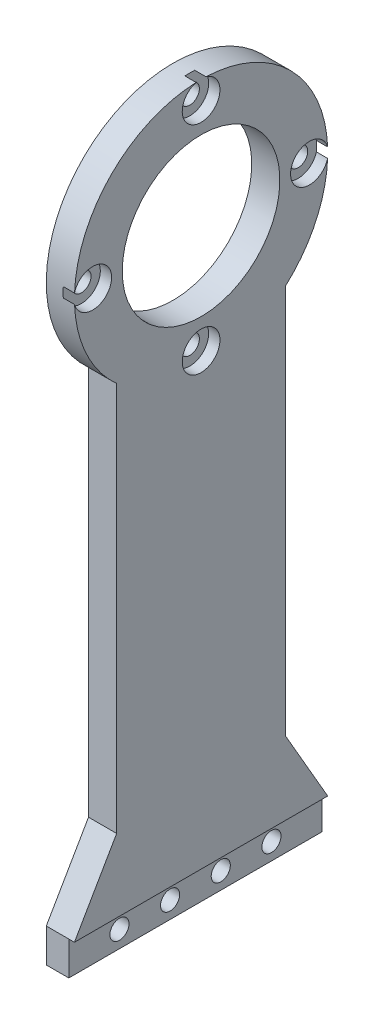
ISO-10303-21;
HEADER;
FILE_DESCRIPTION(('STEP AP214'),'2;1');
FILE_NAME('part.step','',(''),(''),'','','');
FILE_SCHEMA(('AUTOMOTIVE_DESIGN { 1 0 10303 214 1 1 1 1 }'));
ENDSEC;
DATA;
#1=APPLICATION_CONTEXT('core data for automotive mechanical design processes');
#2=APPLICATION_PROTOCOL_DEFINITION('international standard','automotive_design',2000,#1);
#3=PRODUCT_CONTEXT('',#1,'mechanical');
#4=PRODUCT('Part','Part','',(#3));
#5=PRODUCT_RELATED_PRODUCT_CATEGORY('part','',(#4));
#6=PRODUCT_DEFINITION_FORMATION('','',#4);
#7=PRODUCT_DEFINITION_CONTEXT('part definition',#1,'design');
#8=PRODUCT_DEFINITION('design','',#6,#7);
#9=PRODUCT_DEFINITION_SHAPE('','',#8);
#10=(LENGTH_UNIT() NAMED_UNIT(*) SI_UNIT(.MILLI.,.METRE.));
#11=(NAMED_UNIT(*) PLANE_ANGLE_UNIT() SI_UNIT($,.RADIAN.));
#12=(NAMED_UNIT(*) SI_UNIT($,.STERADIAN.) SOLID_ANGLE_UNIT());
#13=UNCERTAINTY_MEASURE_WITH_UNIT(LENGTH_MEASURE(1.E-05),#10,'distance_accuracy_value','');
#14=(GEOMETRIC_REPRESENTATION_CONTEXT(3) GLOBAL_UNCERTAINTY_ASSIGNED_CONTEXT((#13)) GLOBAL_UNIT_ASSIGNED_CONTEXT((#10,
#11,#12)) REPRESENTATION_CONTEXT('',''));
#15=CARTESIAN_POINT('',(0.,0.,0.));
#16=DIRECTION('',(0.,0.,1.));
#17=DIRECTION('',(1.,0.,0.));
#18=AXIS2_PLACEMENT_3D('',#15,#16,#17);
#19=CARTESIAN_POINT('',(0.,227.,30.));
#20=DIRECTION('',(0.,0.,-1.));
#21=DIRECTION('',(-1.,0.,0.));
#22=AXIS2_PLACEMENT_3D('',#19,#20,#21);
#23=PLANE('',#22);
#24=DIRECTION('',(0.,-1.,0.));
#25=VECTOR('',#24,1.);
#26=CARTESIAN_POINT('',(0.,227.,30.));
#27=LINE('',#26,#25);
#28=CARTESIAN_POINT('',(0.,88.2294901687515,30.));
#29=VERTEX_POINT('',#28);
#30=CARTESIAN_POINT('',(0.,18.9903810567669,30.));
#31=VERTEX_POINT('',#30);
#32=EDGE_CURVE('E60',#29,#31,#27,.T.);
#33=ORIENTED_EDGE('',*,*,#32,.T.);
#34=DIRECTION('',(1.,0.,0.));
#35=VECTOR('',#34,1.);
#36=CARTESIAN_POINT('',(-48.84295827119,18.9903810567669,30.));
#37=LINE('',#36,#35);
#38=CARTESIAN_POINT('',(5.,18.9903810567669,30.));
#39=VERTEX_POINT('',#38);
#40=EDGE_CURVE('E306',#31,#39,#37,.T.);
#41=ORIENTED_EDGE('',*,*,#40,.T.);
#42=DIRECTION('',(0.,-1.,0.));
#43=VECTOR('',#42,1.);
#44=CARTESIAN_POINT('',(5.,227.,30.));
#45=LINE('',#44,#43);
#46=CARTESIAN_POINT('',(5.,88.2294901687515,30.));
#47=VERTEX_POINT('',#46);
#48=EDGE_CURVE('E233',#47,#39,#45,.T.);
#49=ORIENTED_EDGE('',*,*,#48,.F.);
#50=DIRECTION('',(-1.,0.,0.));
#51=VECTOR('',#50,1.);
#52=CARTESIAN_POINT('',(68.6396103067893,88.2294901687515,30.));
#53=LINE('',#52,#51);
#54=EDGE_CURVE('E223',#47,#29,#53,.T.);
#55=ORIENTED_EDGE('',*,*,#54,.T.);
#56=EDGE_LOOP('',(#33,#41,#49,#55));
#57=FACE_BOUND('',#56,.T.);
#58=ADVANCED_FACE('F37',(#57),#23,.F.);
#59=CARTESIAN_POINT('',(0.,227.,0.));
#60=DIRECTION('',(1.,0.,0.));
#61=DIRECTION('',(0.,0.,-1.));
#62=AXIS2_PLACEMENT_3D('',#59,#60,#61);
#63=PLANE('',#62);
#64=CARTESIAN_POINT('',(0.,3.00000000000006,28.5));
#65=DIRECTION('',(1.,0.,0.));
#66=DIRECTION('',(0.,0.,-1.));
#67=AXIS2_PLACEMENT_3D('',#64,#65,#66);
#68=CIRCLE('',#67,1.7);
#69=CARTESIAN_POINT('',(0.,3.00000000000006,26.8));
#70=VERTEX_POINT('',#69);
#71=EDGE_CURVE('E281',#70,#70,#68,.T.);
#72=ORIENTED_EDGE('',*,*,#71,.T.);
#73=EDGE_LOOP('',(#72));
#74=FACE_BOUND('',#73,.T.);
#75=CARTESIAN_POINT('',(0.,3.00000000000006,19.5));
#76=DIRECTION('',(1.,0.,0.));
#77=DIRECTION('',(0.,0.,-1.));
#78=AXIS2_PLACEMENT_3D('',#75,#76,#77);
#79=CIRCLE('',#78,1.7);
#80=CARTESIAN_POINT('',(0.,3.00000000000006,17.8));
#81=VERTEX_POINT('',#80);
#82=EDGE_CURVE('E284',#81,#81,#79,.T.);
#83=ORIENTED_EDGE('',*,*,#82,.T.);
#84=EDGE_LOOP('',(#83));
#85=FACE_BOUND('',#84,.T.);
#86=CARTESIAN_POINT('',(0.,3.00000000000006,10.5));
#87=DIRECTION('',(1.,0.,0.));
#88=DIRECTION('',(0.,0.,-1.));
#89=AXIS2_PLACEMENT_3D('',#86,#87,#88);
#90=CIRCLE('',#89,1.7);
#91=CARTESIAN_POINT('',(0.,3.00000000000006,8.79999999999999));
#92=VERTEX_POINT('',#91);
#93=EDGE_CURVE('E287',#92,#92,#90,.T.);
#94=ORIENTED_EDGE('',*,*,#93,.T.);
#95=EDGE_LOOP('',(#94));
#96=FACE_BOUND('',#95,.T.);
#97=CARTESIAN_POINT('',(0.,3.00000000000006,1.49999999999999));
#98=DIRECTION('',(1.,0.,0.));
#99=DIRECTION('',(0.,0.,-1.));
#100=AXIS2_PLACEMENT_3D('',#97,#98,#99);
#101=CIRCLE('',#100,1.7);
#102=CARTESIAN_POINT('',(0.,3.00000000000006,-0.200000000000008));
#103=VERTEX_POINT('',#102);
#104=EDGE_CURVE('E290',#103,#103,#101,.T.);
#105=ORIENTED_EDGE('',*,*,#104,.T.);
#106=EDGE_LOOP('',(#105));
#107=FACE_BOUND('',#106,.T.);
#108=CARTESIAN_POINT('',(0.,124.25,15.));
#109=DIRECTION('',(1.,0.,0.));
#110=DIRECTION('',(0.,0.,-1.));
#111=AXIS2_PLACEMENT_3D('',#108,#109,#110);
#112=CIRCLE('',#111,1.69999999999999);
#113=CARTESIAN_POINT('',(0.,124.25,13.3));
#114=VERTEX_POINT('',#113);
#115=EDGE_CURVE('E179',#114,#114,#112,.T.);
#116=ORIENTED_EDGE('',*,*,#115,.T.);
#117=EDGE_LOOP('',(#116));
#118=FACE_BOUND('',#117,.T.);
#119=CARTESIAN_POINT('',(0.,105.,-4.24999999999999));
#120=DIRECTION('',(1.,0.,0.));
#121=DIRECTION('',(0.,0.,-1.));
#122=AXIS2_PLACEMENT_3D('',#119,#120,#121);
#123=CIRCLE('',#122,1.69999999999999);
#124=CARTESIAN_POINT('',(0.,105.,-5.94999999999998));
#125=VERTEX_POINT('',#124);
#126=EDGE_CURVE('E189',#125,#125,#123,.T.);
#127=ORIENTED_EDGE('',*,*,#126,.T.);
#128=EDGE_LOOP('',(#127));
#129=FACE_BOUND('',#128,.T.);
#130=CARTESIAN_POINT('',(0.,85.75,15.));
#131=DIRECTION('',(1.,0.,0.));
#132=DIRECTION('',(0.,0.,-1.));
#133=AXIS2_PLACEMENT_3D('',#130,#131,#132);
#134=CIRCLE('',#133,1.69999999999999);
#135=CARTESIAN_POINT('',(0.,85.75,13.3));
#136=VERTEX_POINT('',#135);
#137=EDGE_CURVE('E201',#136,#136,#134,.T.);
#138=ORIENTED_EDGE('',*,*,#137,.T.);
#139=EDGE_LOOP('',(#138));
#140=FACE_BOUND('',#139,.T.);
#141=CARTESIAN_POINT('',(0.,105.,34.2499999999999));
#142=DIRECTION('',(1.,0.,0.));
#143=DIRECTION('',(0.,0.,-1.));
#144=AXIS2_PLACEMENT_3D('',#141,#142,#143);
#145=CIRCLE('',#144,1.69999999999999);
#146=CARTESIAN_POINT('',(0.,105.,32.5499999999999));
#147=VERTEX_POINT('',#146);
#148=EDGE_CURVE('E212',#147,#147,#145,.T.);
#149=ORIENTED_EDGE('',*,*,#148,.T.);
#150=EDGE_LOOP('',(#149));
#151=FACE_BOUND('',#150,.T.);
#152=CARTESIAN_POINT('',(0.,105.,15.));
#153=DIRECTION('',(-1.,0.,0.));
#154=DIRECTION('',(0.,0.,1.));
#155=AXIS2_PLACEMENT_3D('',#152,#153,#154);
#156=CIRCLE('',#155,14.);
#157=CARTESIAN_POINT('',(0.,105.,29.));
#158=VERTEX_POINT('',#157);
#159=EDGE_CURVE('E215',#158,#158,#156,.T.);
#160=ORIENTED_EDGE('',*,*,#159,.F.);
#161=EDGE_LOOP('',(#160));
#162=FACE_BOUND('',#161,.T.);
#163=CARTESIAN_POINT('',(0.,105.,15.));
#164=DIRECTION('',(-1.,0.,0.));
#165=DIRECTION('',(0.,0.,1.));
#166=AXIS2_PLACEMENT_3D('',#163,#164,#165);
#167=CIRCLE('',#166,22.5);
#168=CARTESIAN_POINT('',(0.,88.2294901687516,0.));
#169=VERTEX_POINT('',#168);
#170=EDGE_CURVE('E219',#29,#169,#167,.T.);
#171=ORIENTED_EDGE('',*,*,#170,.T.);
#172=DIRECTION('',(0.,-1.,0.));
#173=VECTOR('',#172,1.);
#174=CARTESIAN_POINT('',(0.,227.,0.));
#175=LINE('',#174,#173);
#176=CARTESIAN_POINT('',(0.,18.9903810567668,0.));
#177=VERTEX_POINT('',#176);
#178=EDGE_CURVE('E227',#169,#177,#175,.T.);
#179=ORIENTED_EDGE('',*,*,#178,.T.);
#180=DIRECTION('',(0.,-0.866025403784442,-0.499999999999995));
#181=VECTOR('',#180,1.);
#182=CARTESIAN_POINT('',(0.,18.9903810567668,0.));
#183=LINE('',#182,#181);
#184=CARTESIAN_POINT('',(0.,6.,-7.50000000000001));
#185=VERTEX_POINT('',#184);
#186=EDGE_CURVE('E297',#177,#185,#183,.T.);
#187=ORIENTED_EDGE('',*,*,#186,.T.);
#188=DIRECTION('',(0.,-1.,0.));
#189=VECTOR('',#188,1.);
#190=CARTESIAN_POINT('',(0.,6.,-7.50000000000001));
#191=LINE('',#190,#189);
#192=CARTESIAN_POINT('',(0.,0.,-7.50000000000001));
#193=VERTEX_POINT('',#192);
#194=EDGE_CURVE('E294',#185,#193,#191,.T.);
#195=ORIENTED_EDGE('',*,*,#194,.T.);
#196=DIRECTION('',(0.,0.,1.));
#197=VECTOR('',#196,1.);
#198=CARTESIAN_POINT('',(0.,0.,0.));
#199=LINE('',#198,#197);
#200=CARTESIAN_POINT('',(0.,0.,37.5));
#201=VERTEX_POINT('',#200);
#202=EDGE_CURVE('E225',#193,#201,#199,.T.);
#203=ORIENTED_EDGE('',*,*,#202,.T.);
#204=DIRECTION('',(0.,1.,0.));
#205=VECTOR('',#204,1.);
#206=CARTESIAN_POINT('',(0.,6.,37.5));
#207=LINE('',#206,#205);
#208=CARTESIAN_POINT('',(0.,6.,37.5));
#209=VERTEX_POINT('',#208);
#210=EDGE_CURVE('E167',#201,#209,#207,.T.);
#211=ORIENTED_EDGE('',*,*,#210,.T.);
#212=DIRECTION('',(0.,0.866025403784444,-0.499999999999992));
#213=VECTOR('',#212,1.);
#214=CARTESIAN_POINT('',(0.,6.,37.5));
#215=LINE('',#214,#213);
#216=EDGE_CURVE('E171',#209,#31,#215,.T.);
#217=ORIENTED_EDGE('',*,*,#216,.T.);
#218=ORIENTED_EDGE('',*,*,#32,.F.);
#219=EDGE_LOOP('',(#171,#179,#187,#195,#203,#211,#217,#218));
#220=FACE_BOUND('',#219,.T.);
#221=ADVANCED_FACE('F39',(#74,#85,#96,#107,#118,#129,#140,#151,#162,#220),#63,.F.);
#222=CARTESIAN_POINT('',(5.,227.,0.));
#223=DIRECTION('',(-1.,0.,0.));
#224=DIRECTION('',(0.,0.,1.));
#225=AXIS2_PLACEMENT_3D('',#222,#223,#224);
#226=PLANE('',#225);
#227=CARTESIAN_POINT('',(5.,105.,15.));
#228=DIRECTION('',(-1.,0.,0.));
#229=DIRECTION('',(0.,0.,1.));
#230=AXIS2_PLACEMENT_3D('',#227,#228,#229);
#231=CIRCLE('',#230,22.5);
#232=CARTESIAN_POINT('',(5.,105.878142752562,-7.48285714285714));
#233=VERTEX_POINT('',#232);
#234=CARTESIAN_POINT('',(5.,127.482857142857,14.1218572474377));
#235=VERTEX_POINT('',#234);
#236=EDGE_CURVE('E147',#233,#235,#231,.F.);
#237=ORIENTED_EDGE('',*,*,#236,.T.);
#238=CARTESIAN_POINT('',(5.,124.25,15.));
#239=DIRECTION('',(1.,0.,0.));
#240=DIRECTION('',(0.,0.,-1.));
#241=AXIS2_PLACEMENT_3D('',#238,#239,#240);
#242=CIRCLE('',#241,3.35000000000001);
#243=CARTESIAN_POINT('',(5.,127.482857142857,15.8781427525622));
#244=VERTEX_POINT('',#243);
#245=EDGE_CURVE('E152',#244,#235,#242,.T.);
#246=ORIENTED_EDGE('',*,*,#245,.F.);
#247=CARTESIAN_POINT('',(5.,105.878142752562,37.4828571428572));
#248=VERTEX_POINT('',#247);
#249=EDGE_CURVE('E52',#244,#248,#231,.F.);
#250=ORIENTED_EDGE('',*,*,#249,.T.);
#251=CARTESIAN_POINT('',(5.,105.,34.2499999999999));
#252=DIRECTION('',(1.,0.,0.));
#253=DIRECTION('',(0.,0.,-1.));
#254=AXIS2_PLACEMENT_3D('',#251,#252,#253);
#255=CIRCLE('',#254,3.34999999999999);
#256=CARTESIAN_POINT('',(5.,104.121857247438,37.4828571428572));
#257=VERTEX_POINT('',#256);
#258=EDGE_CURVE('E204',#257,#248,#255,.T.);
#259=ORIENTED_EDGE('',*,*,#258,.F.);
#260=EDGE_CURVE('E158',#257,#47,#231,.F.);
#261=ORIENTED_EDGE('',*,*,#260,.T.);
#262=ORIENTED_EDGE('',*,*,#48,.T.);
#263=DIRECTION('',(0.,-0.866025403784443,0.499999999999992));
#264=VECTOR('',#263,1.);
#265=CARTESIAN_POINT('',(5.,6.,37.5));
#266=LINE('',#265,#264);
#267=CARTESIAN_POINT('',(5.,6.,37.5));
#268=VERTEX_POINT('',#267);
#269=EDGE_CURVE('E303',#39,#268,#266,.T.);
#270=ORIENTED_EDGE('',*,*,#269,.T.);
#271=DIRECTION('',(0.,0.,1.));
#272=VECTOR('',#271,1.);
#273=CARTESIAN_POINT('',(5.,6.00000000000006,37.5));
#274=LINE('',#273,#272);
#275=CARTESIAN_POINT('',(5.,6.00000000000006,-7.5));
#276=VERTEX_POINT('',#275);
#277=EDGE_CURVE('E273',#276,#268,#274,.T.);
#278=ORIENTED_EDGE('',*,*,#277,.F.);
#279=DIRECTION('',(0.,0.866025403784442,0.499999999999995));
#280=VECTOR('',#279,1.);
#281=CARTESIAN_POINT('',(5.,18.9903810567668,0.));
#282=LINE('',#281,#280);
#283=CARTESIAN_POINT('',(5.,18.9903810567668,0.));
#284=VERTEX_POINT('',#283);
#285=EDGE_CURVE('E293',#276,#284,#282,.T.);
#286=ORIENTED_EDGE('',*,*,#285,.T.);
#287=DIRECTION('',(0.,-1.,0.));
#288=VECTOR('',#287,1.);
#289=CARTESIAN_POINT('',(5.,227.,0.));
#290=LINE('',#289,#288);
#291=CARTESIAN_POINT('',(5.00000000000001,88.2294901687516,0.));
#292=VERTEX_POINT('',#291);
#293=EDGE_CURVE('E230',#292,#284,#290,.T.);
#294=ORIENTED_EDGE('',*,*,#293,.F.);
#295=CARTESIAN_POINT('',(5.,104.121857247438,-7.48285714285714));
#296=VERTEX_POINT('',#295);
#297=EDGE_CURVE('E156',#292,#296,#231,.F.);
#298=ORIENTED_EDGE('',*,*,#297,.T.);
#299=CARTESIAN_POINT('',(5.,105.,-4.24999999999999));
#300=DIRECTION('',(1.,0.,0.));
#301=DIRECTION('',(0.,0.,-1.));
#302=AXIS2_PLACEMENT_3D('',#299,#300,#301);
#303=CIRCLE('',#302,3.34999999999999);
#304=EDGE_CURVE('E154',#233,#296,#303,.T.);
#305=ORIENTED_EDGE('',*,*,#304,.F.);
#306=EDGE_LOOP('',(#237,#246,#250,#259,#261,#262,#270,#278,#286,#294,#298,#305));
#307=FACE_BOUND('',#306,.T.);
#308=CARTESIAN_POINT('',(5.,85.75,15.));
#309=DIRECTION('',(1.,0.,0.));
#310=DIRECTION('',(0.,0.,-1.));
#311=AXIS2_PLACEMENT_3D('',#308,#309,#310);
#312=CIRCLE('',#311,3.34999999999999);
#313=CARTESIAN_POINT('',(5.,85.75,11.65));
#314=VERTEX_POINT('',#313);
#315=EDGE_CURVE('E192',#314,#314,#312,.T.);
#316=ORIENTED_EDGE('',*,*,#315,.F.);
#317=EDGE_LOOP('',(#316));
#318=FACE_BOUND('',#317,.T.);
#319=CARTESIAN_POINT('',(5.00000000000001,105.,15.));
#320=DIRECTION('',(-1.,0.,0.));
#321=DIRECTION('',(0.,0.,1.));
#322=AXIS2_PLACEMENT_3D('',#319,#320,#321);
#323=CIRCLE('',#322,14.);
#324=CARTESIAN_POINT('',(5.00000000000001,105.,29.));
#325=VERTEX_POINT('',#324);
#326=EDGE_CURVE('E216',#325,#325,#323,.T.);
#327=ORIENTED_EDGE('',*,*,#326,.T.);
#328=EDGE_LOOP('',(#327));
#329=FACE_BOUND('',#328,.T.);
#330=ADVANCED_FACE('F149',(#307,#318,#329),#226,.F.);
#331=CARTESIAN_POINT('',(0.,227.,0.));
#332=DIRECTION('',(0.,0.,1.));
#333=DIRECTION('',(1.,0.,0.));
#334=AXIS2_PLACEMENT_3D('',#331,#332,#333);
#335=PLANE('',#334);
#336=ORIENTED_EDGE('',*,*,#293,.T.);
#337=DIRECTION('',(1.,0.,0.));
#338=VECTOR('',#337,1.);
#339=CARTESIAN_POINT('',(-48.84295827119,18.9903810567668,0.));
#340=LINE('',#339,#338);
#341=EDGE_CURVE('E308',#177,#284,#340,.T.);
#342=ORIENTED_EDGE('',*,*,#341,.F.);
#343=ORIENTED_EDGE('',*,*,#178,.F.);
#344=DIRECTION('',(-1.,0.,0.));
#345=VECTOR('',#344,1.);
#346=CARTESIAN_POINT('',(68.6396103067893,88.2294901687516,0.));
#347=LINE('',#346,#345);
#348=EDGE_CURVE('E237',#169,#292,#347,.F.);
#349=ORIENTED_EDGE('',*,*,#348,.T.);
#350=EDGE_LOOP('',(#336,#342,#343,#349));
#351=FACE_BOUND('',#350,.T.);
#352=ADVANCED_FACE('F353',(#351),#335,.F.);
#353=CARTESIAN_POINT('',(0.,0.,0.));
#354=DIRECTION('',(0.,1.,0.));
#355=DIRECTION('',(0.,0.,1.));
#356=AXIS2_PLACEMENT_3D('',#353,#354,#355);
#357=PLANE('',#356);
#358=DIRECTION('',(1.,0.,0.));
#359=VECTOR('',#358,1.);
#360=CARTESIAN_POINT('',(-48.84295827119,0.,-7.50000000000001));
#361=LINE('',#360,#359);
#362=CARTESIAN_POINT('',(4.,0.,-7.5));
#363=VERTEX_POINT('',#362);
#364=EDGE_CURVE('E312',#193,#363,#361,.T.);
#365=ORIENTED_EDGE('',*,*,#364,.T.);
#366=DIRECTION('',(0.,0.,-1.));
#367=VECTOR('',#366,1.);
#368=CARTESIAN_POINT('',(4.,0.,37.5));
#369=LINE('',#368,#367);
#370=CARTESIAN_POINT('',(4.,0.,37.5));
#371=VERTEX_POINT('',#370);
#372=EDGE_CURVE('E326',#371,#363,#369,.T.);
#373=ORIENTED_EDGE('',*,*,#372,.F.);
#374=DIRECTION('',(1.,0.,0.));
#375=VECTOR('',#374,1.);
#376=CARTESIAN_POINT('',(-48.84295827119,0.,37.5));
#377=LINE('',#376,#375);
#378=EDGE_CURVE('E174',#201,#371,#377,.T.);
#379=ORIENTED_EDGE('',*,*,#378,.F.);
#380=ORIENTED_EDGE('',*,*,#202,.F.);
#381=EDGE_LOOP('',(#365,#373,#379,#380));
#382=FACE_BOUND('',#381,.T.);
#383=ADVANCED_FACE('F325',(#382),#357,.F.);
#384=CARTESIAN_POINT('',(68.6396103067893,105.,15.));
#385=DIRECTION('',(-1.,0.,0.));
#386=DIRECTION('',(0.,0.,1.));
#387=AXIS2_PLACEMENT_3D('',#384,#385,#386);
#388=CYLINDRICAL_SURFACE('',#387,22.5);
#389=DIRECTION('',(1.,0.,0.));
#390=VECTOR('',#389,1.);
#391=CARTESIAN_POINT('',(4.,105.878142752562,37.4828571428572));
#392=LINE('',#391,#390);
#393=CARTESIAN_POINT('',(3.,105.878142752562,37.4828571428572));
#394=VERTEX_POINT('',#393);
#395=EDGE_CURVE('E245',#248,#394,#392,.F.);
#396=ORIENTED_EDGE('',*,*,#395,.F.);
#397=ORIENTED_EDGE('',*,*,#249,.F.);
#398=DIRECTION('',(1.,0.,0.));
#399=VECTOR('',#398,1.);
#400=CARTESIAN_POINT('',(2.5,127.482857142857,15.8781427525622));
#401=LINE('',#400,#399);
#402=CARTESIAN_POINT('',(3.,127.482857142857,15.8781427525622));
#403=VERTEX_POINT('',#402);
#404=EDGE_CURVE('E45',#403,#244,#401,.T.);
#405=ORIENTED_EDGE('',*,*,#404,.F.);
#406=CARTESIAN_POINT('',(3.,105.,15.));
#407=DIRECTION('',(-1.,0.,0.));
#408=DIRECTION('',(0.,0.,1.));
#409=AXIS2_PLACEMENT_3D('',#406,#407,#408);
#410=CIRCLE('',#409,22.5);
#411=CARTESIAN_POINT('',(3.,127.482857142857,14.1218572474377));
#412=VERTEX_POINT('',#411);
#413=EDGE_CURVE('E161',#412,#403,#410,.F.);
#414=ORIENTED_EDGE('',*,*,#413,.F.);
#415=DIRECTION('',(1.,0.,0.));
#416=VECTOR('',#415,1.);
#417=CARTESIAN_POINT('',(2.5,127.482857142857,14.1218572474377));
#418=LINE('',#417,#416);
#419=EDGE_CURVE('E11',#235,#412,#418,.F.);
#420=ORIENTED_EDGE('',*,*,#419,.F.);
#421=ORIENTED_EDGE('',*,*,#236,.F.);
#422=DIRECTION('',(1.,0.,0.));
#423=VECTOR('',#422,1.);
#424=CARTESIAN_POINT('',(4.,105.878142752562,-7.48285714285714));
#425=LINE('',#424,#423);
#426=CARTESIAN_POINT('',(3.,105.878142752562,-7.48285714285714));
#427=VERTEX_POINT('',#426);
#428=EDGE_CURVE('E247',#427,#233,#425,.T.);
#429=ORIENTED_EDGE('',*,*,#428,.F.);
#430=CARTESIAN_POINT('',(3.,105.,15.));
#431=DIRECTION('',(-1.,0.,0.));
#432=DIRECTION('',(0.,0.,1.));
#433=AXIS2_PLACEMENT_3D('',#430,#431,#432);
#434=CIRCLE('',#433,22.5);
#435=CARTESIAN_POINT('',(3.,104.121857247438,-7.48285714285714));
#436=VERTEX_POINT('',#435);
#437=EDGE_CURVE('E249',#436,#427,#434,.F.);
#438=ORIENTED_EDGE('',*,*,#437,.F.);
#439=DIRECTION('',(1.,0.,0.));
#440=VECTOR('',#439,1.);
#441=CARTESIAN_POINT('',(4.,104.121857247438,-7.48285714285714));
#442=LINE('',#441,#440);
#443=EDGE_CURVE('E252',#296,#436,#442,.F.);
#444=ORIENTED_EDGE('',*,*,#443,.F.);
#445=ORIENTED_EDGE('',*,*,#297,.F.);
#446=ORIENTED_EDGE('',*,*,#348,.F.);
#447=ORIENTED_EDGE('',*,*,#170,.F.);
#448=ORIENTED_EDGE('',*,*,#54,.F.);
#449=ORIENTED_EDGE('',*,*,#260,.F.);
#450=DIRECTION('',(1.,0.,0.));
#451=VECTOR('',#450,1.);
#452=CARTESIAN_POINT('',(4.,104.121857247438,37.4828571428572));
#453=LINE('',#452,#451);
#454=CARTESIAN_POINT('',(3.,104.121857247438,37.4828571428572));
#455=VERTEX_POINT('',#454);
#456=EDGE_CURVE('E240',#455,#257,#453,.T.);
#457=ORIENTED_EDGE('',*,*,#456,.F.);
#458=CARTESIAN_POINT('',(3.,105.,15.));
#459=DIRECTION('',(-1.,0.,0.));
#460=DIRECTION('',(0.,0.,1.));
#461=AXIS2_PLACEMENT_3D('',#458,#459,#460);
#462=CIRCLE('',#461,22.5);
#463=EDGE_CURVE('E242',#394,#455,#462,.F.);
#464=ORIENTED_EDGE('',*,*,#463,.F.);
#465=EDGE_LOOP('',(#396,#397,#405,#414,#420,#421,#429,#438,#444,#445,#446,#447,#448,#449,#457,#464));
#466=FACE_BOUND('',#465,.T.);
#467=ADVANCED_FACE('F159',(#466),#388,.T.);
#468=CARTESIAN_POINT('',(5.00000000000001,105.,15.));
#469=DIRECTION('',(-1.,0.,0.));
#470=DIRECTION('',(0.,0.,1.));
#471=AXIS2_PLACEMENT_3D('',#468,#469,#470);
#472=CYLINDRICAL_SURFACE('',#471,14.);
#473=ORIENTED_EDGE('',*,*,#326,.F.);
#474=EDGE_LOOP('',(#473));
#475=FACE_BOUND('',#474,.T.);
#476=ORIENTED_EDGE('',*,*,#159,.T.);
#477=EDGE_LOOP('',(#476));
#478=FACE_BOUND('',#477,.T.);
#479=ADVANCED_FACE('F385',(#475,#478),#472,.F.);
#480=CARTESIAN_POINT('',(5.,105.,34.2499999999999));
#481=DIRECTION('',(1.,0.,0.));
#482=DIRECTION('',(0.,0.,-1.));
#483=AXIS2_PLACEMENT_3D('',#480,#481,#482);
#484=CYLINDRICAL_SURFACE('',#483,1.7);
#485=ORIENTED_EDGE('',*,*,#148,.F.);
#486=EDGE_LOOP('',(#485));
#487=FACE_BOUND('',#486,.T.);
#488=CARTESIAN_POINT('',(3.,105.,34.2499999999999));
#489=DIRECTION('',(1.,0.,0.));
#490=DIRECTION('',(0.,0.,-1.));
#491=AXIS2_PLACEMENT_3D('',#488,#489,#490);
#492=CIRCLE('',#491,1.70000000000001);
#493=CARTESIAN_POINT('',(3.,105.,32.5499999999999));
#494=VERTEX_POINT('',#493);
#495=EDGE_CURVE('E209',#494,#494,#492,.T.);
#496=ORIENTED_EDGE('',*,*,#495,.T.);
#497=EDGE_LOOP('',(#496));
#498=FACE_BOUND('',#497,.T.);
#499=ADVANCED_FACE('F388',(#487,#498),#484,.F.);
#500=CARTESIAN_POINT('',(3.,106.7,34.2499999999999));
#501=DIRECTION('',(-1.,0.,0.));
#502=DIRECTION('',(0.,0.,1.));
#503=AXIS2_PLACEMENT_3D('',#500,#501,#502);
#504=PLANE('',#503);
#505=ORIENTED_EDGE('',*,*,#463,.T.);
#506=CARTESIAN_POINT('',(3.,105.,34.2499999999999));
#507=DIRECTION('',(1.,0.,0.));
#508=DIRECTION('',(0.,0.,-1.));
#509=AXIS2_PLACEMENT_3D('',#506,#507,#508);
#510=CIRCLE('',#509,3.34999999999999);
#511=EDGE_CURVE('E206',#455,#394,#510,.T.);
#512=ORIENTED_EDGE('',*,*,#511,.T.);
#513=EDGE_LOOP('',(#505,#512));
#514=FACE_BOUND('',#513,.T.);
#515=ORIENTED_EDGE('',*,*,#495,.F.);
#516=EDGE_LOOP('',(#515));
#517=FACE_BOUND('',#516,.T.);
#518=ADVANCED_FACE('F392',(#514,#517),#504,.F.);
#519=CARTESIAN_POINT('',(5.,105.,34.2499999999999));
#520=DIRECTION('',(1.,0.,0.));
#521=DIRECTION('',(0.,0.,-1.));
#522=AXIS2_PLACEMENT_3D('',#519,#520,#521);
#523=CYLINDRICAL_SURFACE('',#522,3.34999999999999);
#524=ORIENTED_EDGE('',*,*,#395,.T.);
#525=ORIENTED_EDGE('',*,*,#511,.F.);
#526=ORIENTED_EDGE('',*,*,#456,.T.);
#527=ORIENTED_EDGE('',*,*,#258,.T.);
#528=EDGE_LOOP('',(#524,#525,#526,#527));
#529=FACE_BOUND('',#528,.T.);
#530=ADVANCED_FACE('F396',(#529),#523,.F.);
#531=CARTESIAN_POINT('',(5.,85.75,15.));
#532=DIRECTION('',(1.,0.,0.));
#533=DIRECTION('',(0.,0.,-1.));
#534=AXIS2_PLACEMENT_3D('',#531,#532,#533);
#535=CYLINDRICAL_SURFACE('',#534,1.7);
#536=ORIENTED_EDGE('',*,*,#137,.F.);
#537=EDGE_LOOP('',(#536));
#538=FACE_BOUND('',#537,.T.);
#539=CARTESIAN_POINT('',(3.,85.75,15.));
#540=DIRECTION('',(1.,0.,0.));
#541=DIRECTION('',(0.,0.,-1.));
#542=AXIS2_PLACEMENT_3D('',#539,#540,#541);
#543=CIRCLE('',#542,1.70000000000001);
#544=CARTESIAN_POINT('',(3.,85.75,13.3));
#545=VERTEX_POINT('',#544);
#546=EDGE_CURVE('E198',#545,#545,#543,.T.);
#547=ORIENTED_EDGE('',*,*,#546,.T.);
#548=EDGE_LOOP('',(#547));
#549=FACE_BOUND('',#548,.T.);
#550=ADVANCED_FACE('F400',(#538,#549),#535,.F.);
#551=CARTESIAN_POINT('',(3.,87.45,15.));
#552=DIRECTION('',(-1.,0.,0.));
#553=DIRECTION('',(0.,0.,1.));
#554=AXIS2_PLACEMENT_3D('',#551,#552,#553);
#555=PLANE('',#554);
#556=ORIENTED_EDGE('',*,*,#546,.F.);
#557=EDGE_LOOP('',(#556));
#558=FACE_BOUND('',#557,.T.);
#559=CARTESIAN_POINT('',(3.,85.75,15.));
#560=DIRECTION('',(1.,0.,0.));
#561=DIRECTION('',(0.,0.,-1.));
#562=AXIS2_PLACEMENT_3D('',#559,#560,#561);
#563=CIRCLE('',#562,3.34999999999999);
#564=CARTESIAN_POINT('',(3.,85.75,11.65));
#565=VERTEX_POINT('',#564);
#566=EDGE_CURVE('E195',#565,#565,#563,.T.);
#567=ORIENTED_EDGE('',*,*,#566,.T.);
#568=EDGE_LOOP('',(#567));
#569=FACE_BOUND('',#568,.T.);
#570=ADVANCED_FACE('F404',(#558,#569),#555,.F.);
#571=CARTESIAN_POINT('',(5.,85.75,15.));
#572=DIRECTION('',(1.,0.,0.));
#573=DIRECTION('',(0.,0.,-1.));
#574=AXIS2_PLACEMENT_3D('',#571,#572,#573);
#575=CYLINDRICAL_SURFACE('',#574,3.34999999999999);
#576=ORIENTED_EDGE('',*,*,#566,.F.);
#577=EDGE_LOOP('',(#576));
#578=FACE_BOUND('',#577,.T.);
#579=ORIENTED_EDGE('',*,*,#315,.T.);
#580=EDGE_LOOP('',(#579));
#581=FACE_BOUND('',#580,.T.);
#582=ADVANCED_FACE('F408',(#578,#581),#575,.F.);
#583=CARTESIAN_POINT('',(5.,105.,-4.24999999999999));
#584=DIRECTION('',(1.,0.,0.));
#585=DIRECTION('',(0.,0.,-1.));
#586=AXIS2_PLACEMENT_3D('',#583,#584,#585);
#587=CYLINDRICAL_SURFACE('',#586,1.7);
#588=ORIENTED_EDGE('',*,*,#126,.F.);
#589=EDGE_LOOP('',(#588));
#590=FACE_BOUND('',#589,.T.);
#591=CARTESIAN_POINT('',(3.,105.,-4.24999999999999));
#592=DIRECTION('',(1.,0.,0.));
#593=DIRECTION('',(0.,0.,-1.));
#594=AXIS2_PLACEMENT_3D('',#591,#592,#593);
#595=CIRCLE('',#594,1.70000000000001);
#596=CARTESIAN_POINT('',(3.,105.,-5.95));
#597=VERTEX_POINT('',#596);
#598=EDGE_CURVE('E186',#597,#597,#595,.T.);
#599=ORIENTED_EDGE('',*,*,#598,.T.);
#600=EDGE_LOOP('',(#599));
#601=FACE_BOUND('',#600,.T.);
#602=ADVANCED_FACE('F412',(#590,#601),#587,.F.);
#603=CARTESIAN_POINT('',(3.,106.7,-4.24999999999999));
#604=DIRECTION('',(-1.,0.,0.));
#605=DIRECTION('',(0.,0.,1.));
#606=AXIS2_PLACEMENT_3D('',#603,#604,#605);
#607=PLANE('',#606);
#608=ORIENTED_EDGE('',*,*,#437,.T.);
#609=CARTESIAN_POINT('',(3.,105.,-4.24999999999999));
#610=DIRECTION('',(1.,0.,0.));
#611=DIRECTION('',(0.,0.,-1.));
#612=AXIS2_PLACEMENT_3D('',#609,#610,#611);
#613=CIRCLE('',#612,3.34999999999999);
#614=EDGE_CURVE('E183',#427,#436,#613,.T.);
#615=ORIENTED_EDGE('',*,*,#614,.T.);
#616=EDGE_LOOP('',(#608,#615));
#617=FACE_BOUND('',#616,.T.);
#618=ORIENTED_EDGE('',*,*,#598,.F.);
#619=EDGE_LOOP('',(#618));
#620=FACE_BOUND('',#619,.T.);
#621=ADVANCED_FACE('F416',(#617,#620),#607,.F.);
#622=CARTESIAN_POINT('',(5.,105.,-4.24999999999999));
#623=DIRECTION('',(1.,0.,0.));
#624=DIRECTION('',(0.,0.,-1.));
#625=AXIS2_PLACEMENT_3D('',#622,#623,#624);
#626=CYLINDRICAL_SURFACE('',#625,3.34999999999999);
#627=ORIENTED_EDGE('',*,*,#443,.T.);
#628=ORIENTED_EDGE('',*,*,#614,.F.);
#629=ORIENTED_EDGE('',*,*,#428,.T.);
#630=ORIENTED_EDGE('',*,*,#304,.T.);
#631=EDGE_LOOP('',(#627,#628,#629,#630));
#632=FACE_BOUND('',#631,.T.);
#633=ADVANCED_FACE('F367',(#632),#626,.F.);
#634=CARTESIAN_POINT('',(5.,124.25,15.));
#635=DIRECTION('',(1.,0.,0.));
#636=DIRECTION('',(0.,0.,-1.));
#637=AXIS2_PLACEMENT_3D('',#634,#635,#636);
#638=CYLINDRICAL_SURFACE('',#637,1.70000000000001);
#639=ORIENTED_EDGE('',*,*,#115,.F.);
#640=EDGE_LOOP('',(#639));
#641=FACE_BOUND('',#640,.T.);
#642=CARTESIAN_POINT('',(3.,124.25,15.));
#643=DIRECTION('',(1.,0.,0.));
#644=DIRECTION('',(0.,0.,-1.));
#645=AXIS2_PLACEMENT_3D('',#642,#643,#644);
#646=CIRCLE('',#645,1.70000000000002);
#647=CARTESIAN_POINT('',(3.,124.25,13.2999999999999));
#648=VERTEX_POINT('',#647);
#649=EDGE_CURVE('E169',#648,#648,#646,.T.);
#650=ORIENTED_EDGE('',*,*,#649,.T.);
#651=EDGE_LOOP('',(#650));
#652=FACE_BOUND('',#651,.T.);
#653=ADVANCED_FACE('F359',(#641,#652),#638,.F.);
#654=CARTESIAN_POINT('',(3.,125.95,15.));
#655=DIRECTION('',(-1.,0.,0.));
#656=DIRECTION('',(0.,0.,1.));
#657=AXIS2_PLACEMENT_3D('',#654,#655,#656);
#658=PLANE('',#657);
#659=ORIENTED_EDGE('',*,*,#649,.F.);
#660=EDGE_LOOP('',(#659));
#661=FACE_BOUND('',#660,.T.);
#662=CARTESIAN_POINT('',(3.,124.25,15.));
#663=DIRECTION('',(1.,0.,0.));
#664=DIRECTION('',(0.,0.,-1.));
#665=AXIS2_PLACEMENT_3D('',#662,#663,#664);
#666=CIRCLE('',#665,3.35000000000001);
#667=EDGE_CURVE('E166',#403,#412,#666,.T.);
#668=ORIENTED_EDGE('',*,*,#667,.T.);
#669=ORIENTED_EDGE('',*,*,#413,.T.);
#670=EDGE_LOOP('',(#668,#669));
#671=FACE_BOUND('',#670,.T.);
#672=ADVANCED_FACE('F357',(#661,#671),#658,.F.);
#673=CARTESIAN_POINT('',(5.,124.25,15.));
#674=DIRECTION('',(1.,0.,0.));
#675=DIRECTION('',(0.,0.,-1.));
#676=AXIS2_PLACEMENT_3D('',#673,#674,#675);
#677=CYLINDRICAL_SURFACE('',#676,3.35000000000001);
#678=ORIENTED_EDGE('',*,*,#245,.T.);
#679=ORIENTED_EDGE('',*,*,#419,.T.);
#680=ORIENTED_EDGE('',*,*,#667,.F.);
#681=ORIENTED_EDGE('',*,*,#404,.T.);
#682=EDGE_LOOP('',(#678,#679,#680,#681));
#683=FACE_BOUND('',#682,.T.);
#684=ADVANCED_FACE('F165',(#683),#677,.F.);
#685=CARTESIAN_POINT('',(-48.84295827119,6.,-7.50000000000001));
#686=DIRECTION('',(0.,0.,-1.));
#687=DIRECTION('',(-1.,0.,0.));
#688=AXIS2_PLACEMENT_3D('',#685,#686,#687);
#689=PLANE('',#688);
#690=DIRECTION('',(0.,1.,0.));
#691=VECTOR('',#690,1.);
#692=CARTESIAN_POINT('',(4.,0.,-7.5));
#693=LINE('',#692,#691);
#694=CARTESIAN_POINT('',(4.,6.00000000000006,-7.5));
#695=VERTEX_POINT('',#694);
#696=EDGE_CURVE('E329',#363,#695,#693,.T.);
#697=ORIENTED_EDGE('',*,*,#696,.F.);
#698=ORIENTED_EDGE('',*,*,#364,.F.);
#699=ORIENTED_EDGE('',*,*,#194,.F.);
#700=DIRECTION('',(1.,0.,0.));
#701=VECTOR('',#700,1.);
#702=CARTESIAN_POINT('',(-48.84295827119,6.,-7.50000000000001));
#703=LINE('',#702,#701);
#704=EDGE_CURVE('E310',#185,#695,#703,.T.);
#705=ORIENTED_EDGE('',*,*,#704,.T.);
#706=EDGE_LOOP('',(#697,#698,#699,#705));
#707=FACE_BOUND('',#706,.T.);
#708=ADVANCED_FACE('F348',(#707),#689,.T.);
#709=CARTESIAN_POINT('',(-48.84295827119,18.9903810567668,0.));
#710=DIRECTION('',(0.,0.499999999999995,-0.866025403784441));
#711=DIRECTION('',(0.,0.866025403784442,0.499999999999995));
#712=AXIS2_PLACEMENT_3D('',#709,#710,#711);
#713=PLANE('',#712);
#714=ORIENTED_EDGE('',*,*,#186,.F.);
#715=ORIENTED_EDGE('',*,*,#341,.T.);
#716=ORIENTED_EDGE('',*,*,#285,.F.);
#717=DIRECTION('',(1.,0.,0.));
#718=VECTOR('',#717,1.);
#719=CARTESIAN_POINT('',(4.,6.00000000000006,-7.5));
#720=LINE('',#719,#718);
#721=EDGE_CURVE('E264',#695,#276,#720,.T.);
#722=ORIENTED_EDGE('',*,*,#721,.F.);
#723=ORIENTED_EDGE('',*,*,#704,.F.);
#724=EDGE_LOOP('',(#714,#715,#716,#722,#723));
#725=FACE_BOUND('',#724,.T.);
#726=ADVANCED_FACE('F345',(#725),#713,.T.);
#727=CARTESIAN_POINT('',(-48.84295827119,6.,37.5));
#728=DIRECTION('',(0.,0.,1.));
#729=DIRECTION('',(1.,0.,0.));
#730=AXIS2_PLACEMENT_3D('',#727,#728,#729);
#731=PLANE('',#730);
#732=DIRECTION('',(0.,-1.,0.));
#733=VECTOR('',#732,1.);
#734=CARTESIAN_POINT('',(4.,0.,37.5));
#735=LINE('',#734,#733);
#736=CARTESIAN_POINT('',(4.,6.00000000000006,37.5));
#737=VERTEX_POINT('',#736);
#738=EDGE_CURVE('E324',#737,#371,#735,.T.);
#739=ORIENTED_EDGE('',*,*,#738,.F.);
#740=DIRECTION('',(1.,0.,0.));
#741=VECTOR('',#740,1.);
#742=CARTESIAN_POINT('',(-48.84295827119,6.,37.5));
#743=LINE('',#742,#741);
#744=EDGE_CURVE('E298',#209,#737,#743,.T.);
#745=ORIENTED_EDGE('',*,*,#744,.F.);
#746=ORIENTED_EDGE('',*,*,#210,.F.);
#747=ORIENTED_EDGE('',*,*,#378,.T.);
#748=EDGE_LOOP('',(#739,#745,#746,#747));
#749=FACE_BOUND('',#748,.T.);
#750=ADVANCED_FACE('F322',(#749),#731,.T.);
#751=CARTESIAN_POINT('',(-48.84295827119,6.,37.5));
#752=DIRECTION('',(0.,0.499999999999992,0.866025403784443));
#753=DIRECTION('',(0.,-0.866025403784444,0.499999999999992));
#754=AXIS2_PLACEMENT_3D('',#751,#752,#753);
#755=PLANE('',#754);
#756=ORIENTED_EDGE('',*,*,#216,.F.);
#757=ORIENTED_EDGE('',*,*,#744,.T.);
#758=DIRECTION('',(1.,0.,0.));
#759=VECTOR('',#758,1.);
#760=CARTESIAN_POINT('',(4.,6.00000000000006,37.5));
#761=LINE('',#760,#759);
#762=EDGE_CURVE('E257',#737,#268,#761,.T.);
#763=ORIENTED_EDGE('',*,*,#762,.T.);
#764=ORIENTED_EDGE('',*,*,#269,.F.);
#765=ORIENTED_EDGE('',*,*,#40,.F.);
#766=EDGE_LOOP('',(#756,#757,#763,#764,#765));
#767=FACE_BOUND('',#766,.T.);
#768=ADVANCED_FACE('F437',(#767),#755,.T.);
#769=CARTESIAN_POINT('',(5.,3.00000000000006,1.49999999999999));
#770=DIRECTION('',(1.,0.,0.));
#771=DIRECTION('',(0.,0.,-1.));
#772=AXIS2_PLACEMENT_3D('',#769,#770,#771);
#773=CYLINDRICAL_SURFACE('',#772,1.69999999999999);
#774=CARTESIAN_POINT('',(4.,3.00000000000006,1.49999999999999));
#775=DIRECTION('',(-1.,0.,0.));
#776=DIRECTION('',(0.,0.,1.));
#777=AXIS2_PLACEMENT_3D('',#774,#775,#776);
#778=CIRCLE('',#777,1.69999999999999);
#779=CARTESIAN_POINT('',(4.,3.00000000000006,3.19999999999998));
#780=VERTEX_POINT('',#779);
#781=EDGE_CURVE('E278',#780,#780,#778,.F.);
#782=ORIENTED_EDGE('',*,*,#781,.T.);
#783=EDGE_LOOP('',(#782));
#784=FACE_BOUND('',#783,.T.);
#785=ORIENTED_EDGE('',*,*,#104,.F.);
#786=EDGE_LOOP('',(#785));
#787=FACE_BOUND('',#786,.T.);
#788=ADVANCED_FACE('F439',(#784,#787),#773,.F.);
#789=CARTESIAN_POINT('',(5.,3.00000000000006,10.5));
#790=DIRECTION('',(1.,0.,0.));
#791=DIRECTION('',(0.,0.,-1.));
#792=AXIS2_PLACEMENT_3D('',#789,#790,#791);
#793=CYLINDRICAL_SURFACE('',#792,1.69999999999999);
#794=CARTESIAN_POINT('',(4.,3.00000000000006,10.5));
#795=DIRECTION('',(-1.,0.,0.));
#796=DIRECTION('',(0.,0.,1.));
#797=AXIS2_PLACEMENT_3D('',#794,#795,#796);
#798=CIRCLE('',#797,1.69999999999999);
#799=CARTESIAN_POINT('',(4.,3.00000000000006,12.2));
#800=VERTEX_POINT('',#799);
#801=EDGE_CURVE('E261',#800,#800,#798,.F.);
#802=ORIENTED_EDGE('',*,*,#801,.T.);
#803=EDGE_LOOP('',(#802));
#804=FACE_BOUND('',#803,.T.);
#805=ORIENTED_EDGE('',*,*,#93,.F.);
#806=EDGE_LOOP('',(#805));
#807=FACE_BOUND('',#806,.T.);
#808=ADVANCED_FACE('F445',(#804,#807),#793,.F.);
#809=CARTESIAN_POINT('',(5.,3.00000000000006,19.5));
#810=DIRECTION('',(1.,0.,0.));
#811=DIRECTION('',(0.,0.,-1.));
#812=AXIS2_PLACEMENT_3D('',#809,#810,#811);
#813=CYLINDRICAL_SURFACE('',#812,1.69999999999999);
#814=CARTESIAN_POINT('',(4.,3.00000000000006,19.5));
#815=DIRECTION('',(-1.,0.,0.));
#816=DIRECTION('',(0.,0.,1.));
#817=AXIS2_PLACEMENT_3D('',#814,#815,#816);
#818=CIRCLE('',#817,1.69999999999999);
#819=CARTESIAN_POINT('',(4.,3.00000000000006,21.2));
#820=VERTEX_POINT('',#819);
#821=EDGE_CURVE('E256',#820,#820,#818,.F.);
#822=ORIENTED_EDGE('',*,*,#821,.T.);
#823=EDGE_LOOP('',(#822));
#824=FACE_BOUND('',#823,.T.);
#825=ORIENTED_EDGE('',*,*,#82,.F.);
#826=EDGE_LOOP('',(#825));
#827=FACE_BOUND('',#826,.T.);
#828=ADVANCED_FACE('F486',(#824,#827),#813,.F.);
#829=CARTESIAN_POINT('',(5.,3.00000000000006,28.5));
#830=DIRECTION('',(1.,0.,0.));
#831=DIRECTION('',(0.,0.,-1.));
#832=AXIS2_PLACEMENT_3D('',#829,#830,#831);
#833=CYLINDRICAL_SURFACE('',#832,1.69999999999999);
#834=CARTESIAN_POINT('',(4.,3.00000000000006,28.5));
#835=DIRECTION('',(-1.,0.,0.));
#836=DIRECTION('',(0.,0.,1.));
#837=AXIS2_PLACEMENT_3D('',#834,#835,#836);
#838=CIRCLE('',#837,1.69999999999999);
#839=CARTESIAN_POINT('',(4.,3.00000000000006,30.2));
#840=VERTEX_POINT('',#839);
#841=EDGE_CURVE('E254',#840,#840,#838,.F.);
#842=ORIENTED_EDGE('',*,*,#841,.T.);
#843=EDGE_LOOP('',(#842));
#844=FACE_BOUND('',#843,.T.);
#845=ORIENTED_EDGE('',*,*,#71,.F.);
#846=EDGE_LOOP('',(#845));
#847=FACE_BOUND('',#846,.T.);
#848=ADVANCED_FACE('F495',(#844,#847),#833,.F.);
#849=CARTESIAN_POINT('',(4.,0.,0.));
#850=DIRECTION('',(-1.,0.,0.));
#851=DIRECTION('',(0.,0.,1.));
#852=AXIS2_PLACEMENT_3D('',#849,#850,#851);
#853=PLANE('',#852);
#854=ORIENTED_EDGE('',*,*,#801,.F.);
#855=EDGE_LOOP('',(#854));
#856=FACE_BOUND('',#855,.T.);
#857=ORIENTED_EDGE('',*,*,#841,.F.);
#858=EDGE_LOOP('',(#857));
#859=FACE_BOUND('',#858,.T.);
#860=ORIENTED_EDGE('',*,*,#738,.T.);
#861=ORIENTED_EDGE('',*,*,#372,.T.);
#862=ORIENTED_EDGE('',*,*,#696,.T.);
#863=DIRECTION('',(0.,0.,1.));
#864=VECTOR('',#863,1.);
#865=CARTESIAN_POINT('',(4.,6.00000000000006,37.5));
#866=LINE('',#865,#864);
#867=EDGE_CURVE('E270',#695,#737,#866,.T.);
#868=ORIENTED_EDGE('',*,*,#867,.T.);
#869=EDGE_LOOP('',(#860,#861,#862,#868));
#870=FACE_BOUND('',#869,.T.);
#871=ORIENTED_EDGE('',*,*,#821,.F.);
#872=EDGE_LOOP('',(#871));
#873=FACE_BOUND('',#872,.T.);
#874=ORIENTED_EDGE('',*,*,#781,.F.);
#875=EDGE_LOOP('',(#874));
#876=FACE_BOUND('',#875,.T.);
#877=ADVANCED_FACE('F336',(#856,#859,#870,#873,#876),#853,.F.);
#878=CARTESIAN_POINT('',(4.,6.00000000000006,37.5));
#879=DIRECTION('',(0.,1.,0.));
#880=DIRECTION('',(0.,0.,1.));
#881=AXIS2_PLACEMENT_3D('',#878,#879,#880);
#882=PLANE('',#881);
#883=ORIENTED_EDGE('',*,*,#277,.T.);
#884=ORIENTED_EDGE('',*,*,#762,.F.);
#885=ORIENTED_EDGE('',*,*,#867,.F.);
#886=ORIENTED_EDGE('',*,*,#721,.T.);
#887=EDGE_LOOP('',(#883,#884,#885,#886));
#888=FACE_BOUND('',#887,.T.);
#889=ADVANCED_FACE('F340',(#888),#882,.F.);
#890=CLOSED_SHELL('',(#58,#221,#330,#352,#383,#467,#479,#499,#518,#530,#550,#570,#582,#602,#621,
#633,#653,#672,#684,#708,#726,#750,#768,#788,#808,#828,#848,#877,#889));
#891=MANIFOLD_SOLID_BREP('B2',#890);
#892=ADVANCED_BREP_SHAPE_REPRESENTATION('',(#18,#891),#14);
#893=SHAPE_DEFINITION_REPRESENTATION(#9,#892);
ENDSEC;
END-ISO-10303-21;
